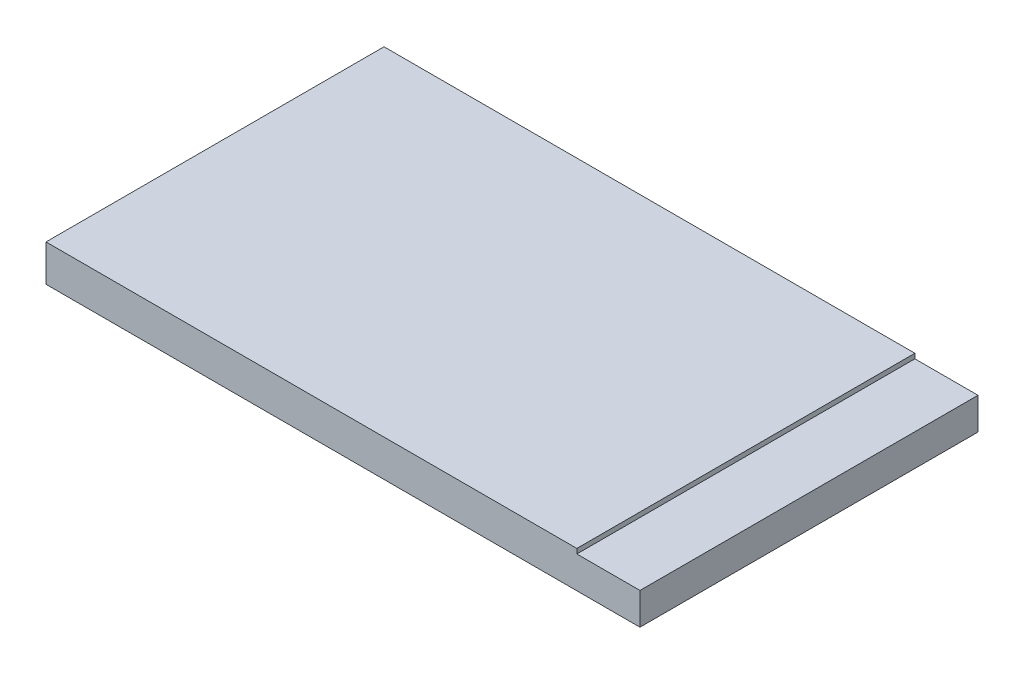
ISO-10303-21;
HEADER;
FILE_DESCRIPTION(('STEP AP214'),'2;1');
FILE_NAME('part.step','',(''),(''),'','','');
FILE_SCHEMA(('AUTOMOTIVE_DESIGN { 1 0 10303 214 1 1 1 1 }'));
ENDSEC;
DATA;
#1=APPLICATION_CONTEXT('core data for automotive mechanical design processes');
#2=APPLICATION_PROTOCOL_DEFINITION('international standard','automotive_design',2000,#1);
#3=PRODUCT_CONTEXT('',#1,'mechanical');
#4=PRODUCT('Part','Part','',(#3));
#5=PRODUCT_RELATED_PRODUCT_CATEGORY('part','',(#4));
#6=PRODUCT_DEFINITION_FORMATION('','',#4);
#7=PRODUCT_DEFINITION_CONTEXT('part definition',#1,'design');
#8=PRODUCT_DEFINITION('design','',#6,#7);
#9=PRODUCT_DEFINITION_SHAPE('','',#8);
#10=(LENGTH_UNIT() NAMED_UNIT(*) SI_UNIT(.MILLI.,.METRE.));
#11=(NAMED_UNIT(*) PLANE_ANGLE_UNIT() SI_UNIT($,.RADIAN.));
#12=(NAMED_UNIT(*) SI_UNIT($,.STERADIAN.) SOLID_ANGLE_UNIT());
#13=UNCERTAINTY_MEASURE_WITH_UNIT(LENGTH_MEASURE(1.E-05),#10,'distance_accuracy_value','');
#14=(GEOMETRIC_REPRESENTATION_CONTEXT(3) GLOBAL_UNCERTAINTY_ASSIGNED_CONTEXT((#13)) GLOBAL_UNIT_ASSIGNED_CONTEXT((#10,
#11,#12)) REPRESENTATION_CONTEXT('',''));
#15=CARTESIAN_POINT('',(0.,0.,0.));
#16=DIRECTION('',(0.,0.,1.));
#17=DIRECTION('',(1.,0.,0.));
#18=AXIS2_PLACEMENT_3D('',#15,#16,#17);
#19=CARTESIAN_POINT('',(-15.621,1.6764,8.89));
#20=DIRECTION('',(1.,0.,0.));
#21=DIRECTION('',(0.,0.,-1.));
#22=AXIS2_PLACEMENT_3D('',#19,#20,#21);
#23=PLANE('',#22);
#24=DIRECTION('',(0.,0.,1.));
#25=VECTOR('',#24,1.);
#26=CARTESIAN_POINT('',(-15.621,0.,8.89));
#27=LINE('',#26,#25);
#28=CARTESIAN_POINT('',(-15.621,0.,-8.89));
#29=VERTEX_POINT('',#28);
#30=CARTESIAN_POINT('',(-15.621,0.,8.89));
#31=VERTEX_POINT('',#30);
#32=EDGE_CURVE('E92',#29,#31,#27,.T.);
#33=ORIENTED_EDGE('',*,*,#32,.T.);
#34=DIRECTION('',(0.,-1.,0.));
#35=VECTOR('',#34,1.);
#36=CARTESIAN_POINT('',(-15.621,1.6764,8.89));
#37=LINE('',#36,#35);
#38=CARTESIAN_POINT('',(-15.621,1.9304,8.89));
#39=VERTEX_POINT('',#38);
#40=EDGE_CURVE('E11',#39,#31,#37,.T.);
#41=ORIENTED_EDGE('',*,*,#40,.F.);
#42=DIRECTION('',(0.,0.,1.));
#43=VECTOR('',#42,1.);
#44=CARTESIAN_POINT('',(-15.621,1.9304,8.89));
#45=LINE('',#44,#43);
#46=CARTESIAN_POINT('',(-15.621,1.9304,-8.89));
#47=VERTEX_POINT('',#46);
#48=EDGE_CURVE('E94',#47,#39,#45,.T.);
#49=ORIENTED_EDGE('',*,*,#48,.F.);
#50=DIRECTION('',(0.,-1.,0.));
#51=VECTOR('',#50,1.);
#52=CARTESIAN_POINT('',(-15.621,1.6764,-8.89));
#53=LINE('',#52,#51);
#54=EDGE_CURVE('E78',#47,#29,#53,.T.);
#55=ORIENTED_EDGE('',*,*,#54,.T.);
#56=EDGE_LOOP('',(#33,#41,#49,#55));
#57=FACE_BOUND('',#56,.T.);
#58=ADVANCED_FACE('F34',(#57),#23,.F.);
#59=CARTESIAN_POINT('',(15.621,1.6764,8.89));
#60=DIRECTION('',(0.,0.,-1.));
#61=DIRECTION('',(-1.,0.,0.));
#62=AXIS2_PLACEMENT_3D('',#59,#60,#61);
#63=PLANE('',#62);
#64=DIRECTION('',(1.,0.,0.));
#65=VECTOR('',#64,1.);
#66=CARTESIAN_POINT('',(15.621,0.,8.89));
#67=LINE('',#66,#65);
#68=CARTESIAN_POINT('',(15.621,0.,8.89));
#69=VERTEX_POINT('',#68);
#70=EDGE_CURVE('E98',#31,#69,#67,.T.);
#71=ORIENTED_EDGE('',*,*,#70,.T.);
#72=DIRECTION('',(0.,-1.,0.));
#73=VECTOR('',#72,1.);
#74=CARTESIAN_POINT('',(15.621,1.6764,8.89));
#75=LINE('',#74,#73);
#76=CARTESIAN_POINT('',(15.621,1.6764,8.89));
#77=VERTEX_POINT('',#76);
#78=EDGE_CURVE('E41',#77,#69,#75,.T.);
#79=ORIENTED_EDGE('',*,*,#78,.F.);
#80=DIRECTION('',(1.,0.,0.));
#81=VECTOR('',#80,1.);
#82=CARTESIAN_POINT('',(15.621,1.6764,8.89));
#83=LINE('',#82,#81);
#84=CARTESIAN_POINT('',(12.3006761655781,1.6764,8.89));
#85=VERTEX_POINT('',#84);
#86=EDGE_CURVE('E85',#85,#77,#83,.T.);
#87=ORIENTED_EDGE('',*,*,#86,.F.);
#88=DIRECTION('',(0.,-1.,0.));
#89=VECTOR('',#88,1.);
#90=CARTESIAN_POINT('',(12.3006761655781,1.9304,8.89));
#91=LINE('',#90,#89);
#92=CARTESIAN_POINT('',(12.3006761655781,1.9304,8.89));
#93=VERTEX_POINT('',#92);
#94=EDGE_CURVE('E99',#93,#85,#91,.T.);
#95=ORIENTED_EDGE('',*,*,#94,.F.);
#96=DIRECTION('',(1.,0.,0.));
#97=VECTOR('',#96,1.);
#98=CARTESIAN_POINT('',(-15.621,1.9304,8.89));
#99=LINE('',#98,#97);
#100=EDGE_CURVE('E119',#39,#93,#99,.T.);
#101=ORIENTED_EDGE('',*,*,#100,.F.);
#102=ORIENTED_EDGE('',*,*,#40,.T.);
#103=EDGE_LOOP('',(#71,#79,#87,#95,#101,#102));
#104=FACE_BOUND('',#103,.T.);
#105=ADVANCED_FACE('F114',(#104),#63,.F.);
#106=CARTESIAN_POINT('',(15.621,1.6764,8.89));
#107=DIRECTION('',(-1.,0.,0.));
#108=DIRECTION('',(0.,0.,1.));
#109=AXIS2_PLACEMENT_3D('',#106,#107,#108);
#110=PLANE('',#109);
#111=DIRECTION('',(0.,0.,-1.));
#112=VECTOR('',#111,1.);
#113=CARTESIAN_POINT('',(15.621,0.,8.89));
#114=LINE('',#113,#112);
#115=CARTESIAN_POINT('',(15.621,0.,-8.89));
#116=VERTEX_POINT('',#115);
#117=EDGE_CURVE('E86',#69,#116,#114,.T.);
#118=ORIENTED_EDGE('',*,*,#117,.T.);
#119=DIRECTION('',(0.,-1.,0.));
#120=VECTOR('',#119,1.);
#121=CARTESIAN_POINT('',(15.621,1.6764,-8.89));
#122=LINE('',#121,#120);
#123=CARTESIAN_POINT('',(15.621,1.6764,-8.89));
#124=VERTEX_POINT('',#123);
#125=EDGE_CURVE('E81',#124,#116,#122,.T.);
#126=ORIENTED_EDGE('',*,*,#125,.F.);
#127=DIRECTION('',(0.,0.,-1.));
#128=VECTOR('',#127,1.);
#129=CARTESIAN_POINT('',(15.621,1.6764,8.89));
#130=LINE('',#129,#128);
#131=EDGE_CURVE('E54',#77,#124,#130,.T.);
#132=ORIENTED_EDGE('',*,*,#131,.F.);
#133=ORIENTED_EDGE('',*,*,#78,.T.);
#134=EDGE_LOOP('',(#118,#126,#132,#133));
#135=FACE_BOUND('',#134,.T.);
#136=ADVANCED_FACE('F112',(#135),#110,.F.);
#137=CARTESIAN_POINT('',(15.621,1.6764,-8.89));
#138=DIRECTION('',(0.,0.,1.));
#139=DIRECTION('',(1.,0.,0.));
#140=AXIS2_PLACEMENT_3D('',#137,#138,#139);
#141=PLANE('',#140);
#142=DIRECTION('',(-1.,0.,0.));
#143=VECTOR('',#142,1.);
#144=CARTESIAN_POINT('',(15.621,0.,-8.89));
#145=LINE('',#144,#143);
#146=EDGE_CURVE('E74',#116,#29,#145,.T.);
#147=ORIENTED_EDGE('',*,*,#146,.T.);
#148=ORIENTED_EDGE('',*,*,#54,.F.);
#149=DIRECTION('',(-1.,0.,0.));
#150=VECTOR('',#149,1.);
#151=CARTESIAN_POINT('',(-15.621,1.9304,-8.89));
#152=LINE('',#151,#150);
#153=CARTESIAN_POINT('',(12.3006761655781,1.9304,-8.89));
#154=VERTEX_POINT('',#153);
#155=EDGE_CURVE('E133',#154,#47,#152,.T.);
#156=ORIENTED_EDGE('',*,*,#155,.F.);
#157=DIRECTION('',(0.,-1.,0.));
#158=VECTOR('',#157,1.);
#159=CARTESIAN_POINT('',(12.3006761655781,1.9304,-8.89));
#160=LINE('',#159,#158);
#161=CARTESIAN_POINT('',(12.3006761655781,1.6764,-8.89));
#162=VERTEX_POINT('',#161);
#163=EDGE_CURVE('E103',#154,#162,#160,.T.);
#164=ORIENTED_EDGE('',*,*,#163,.T.);
#165=DIRECTION('',(-1.,0.,0.));
#166=VECTOR('',#165,1.);
#167=CARTESIAN_POINT('',(15.621,1.6764,-8.89));
#168=LINE('',#167,#166);
#169=EDGE_CURVE('E95',#124,#162,#168,.T.);
#170=ORIENTED_EDGE('',*,*,#169,.F.);
#171=ORIENTED_EDGE('',*,*,#125,.T.);
#172=EDGE_LOOP('',(#147,#148,#156,#164,#170,#171));
#173=FACE_BOUND('',#172,.T.);
#174=ADVANCED_FACE('F76',(#173),#141,.F.);
#175=CARTESIAN_POINT('',(0.,1.6764,0.));
#176=DIRECTION('',(0.,1.,0.));
#177=DIRECTION('',(0.,0.,1.));
#178=AXIS2_PLACEMENT_3D('',#175,#176,#177);
#179=PLANE('',#178);
#180=DIRECTION('',(0.,0.,-1.));
#181=VECTOR('',#180,1.);
#182=CARTESIAN_POINT('',(12.3006761655781,1.6764,8.89));
#183=LINE('',#182,#181);
#184=EDGE_CURVE('E48',#85,#162,#183,.T.);
#185=ORIENTED_EDGE('',*,*,#184,.F.);
#186=ORIENTED_EDGE('',*,*,#86,.T.);
#187=ORIENTED_EDGE('',*,*,#131,.T.);
#188=ORIENTED_EDGE('',*,*,#169,.T.);
#189=EDGE_LOOP('',(#185,#186,#187,#188));
#190=FACE_BOUND('',#189,.T.);
#191=ADVANCED_FACE('F143',(#190),#179,.T.);
#192=CARTESIAN_POINT('',(0.,0.,0.));
#193=DIRECTION('',(0.,1.,0.));
#194=DIRECTION('',(0.,0.,1.));
#195=AXIS2_PLACEMENT_3D('',#192,#193,#194);
#196=PLANE('',#195);
#197=ORIENTED_EDGE('',*,*,#32,.F.);
#198=ORIENTED_EDGE('',*,*,#146,.F.);
#199=ORIENTED_EDGE('',*,*,#117,.F.);
#200=ORIENTED_EDGE('',*,*,#70,.F.);
#201=EDGE_LOOP('',(#197,#198,#199,#200));
#202=FACE_BOUND('',#201,.T.);
#203=ADVANCED_FACE('F97',(#202),#196,.F.);
#204=CARTESIAN_POINT('',(12.3006761655781,1.9304,8.89));
#205=DIRECTION('',(-1.,0.,0.));
#206=DIRECTION('',(0.,0.,1.));
#207=AXIS2_PLACEMENT_3D('',#204,#205,#206);
#208=PLANE('',#207);
#209=ORIENTED_EDGE('',*,*,#184,.T.);
#210=ORIENTED_EDGE('',*,*,#163,.F.);
#211=DIRECTION('',(0.,0.,-1.));
#212=VECTOR('',#211,1.);
#213=CARTESIAN_POINT('',(12.3006761655781,1.9304,8.89));
#214=LINE('',#213,#212);
#215=EDGE_CURVE('E130',#93,#154,#214,.T.);
#216=ORIENTED_EDGE('',*,*,#215,.F.);
#217=ORIENTED_EDGE('',*,*,#94,.T.);
#218=EDGE_LOOP('',(#209,#210,#216,#217));
#219=FACE_BOUND('',#218,.T.);
#220=ADVANCED_FACE('F137',(#219),#208,.F.);
#221=CARTESIAN_POINT('',(0.,1.9304,0.));
#222=DIRECTION('',(0.,-1.,0.));
#223=DIRECTION('',(0.,0.,-1.));
#224=AXIS2_PLACEMENT_3D('',#221,#222,#223);
#225=PLANE('',#224);
#226=ORIENTED_EDGE('',*,*,#48,.T.);
#227=ORIENTED_EDGE('',*,*,#100,.T.);
#228=ORIENTED_EDGE('',*,*,#215,.T.);
#229=ORIENTED_EDGE('',*,*,#155,.T.);
#230=EDGE_LOOP('',(#226,#227,#228,#229));
#231=FACE_BOUND('',#230,.T.);
#232=ADVANCED_FACE('F132',(#231),#225,.F.);
#233=CLOSED_SHELL('',(#58,#105,#136,#174,#191,#203,#220,#232));
#234=MANIFOLD_SOLID_BREP('B2',#233);
#235=ADVANCED_BREP_SHAPE_REPRESENTATION('',(#18,#234),#14);
#236=SHAPE_DEFINITION_REPRESENTATION(#9,#235);
ENDSEC;
END-ISO-10303-21;
